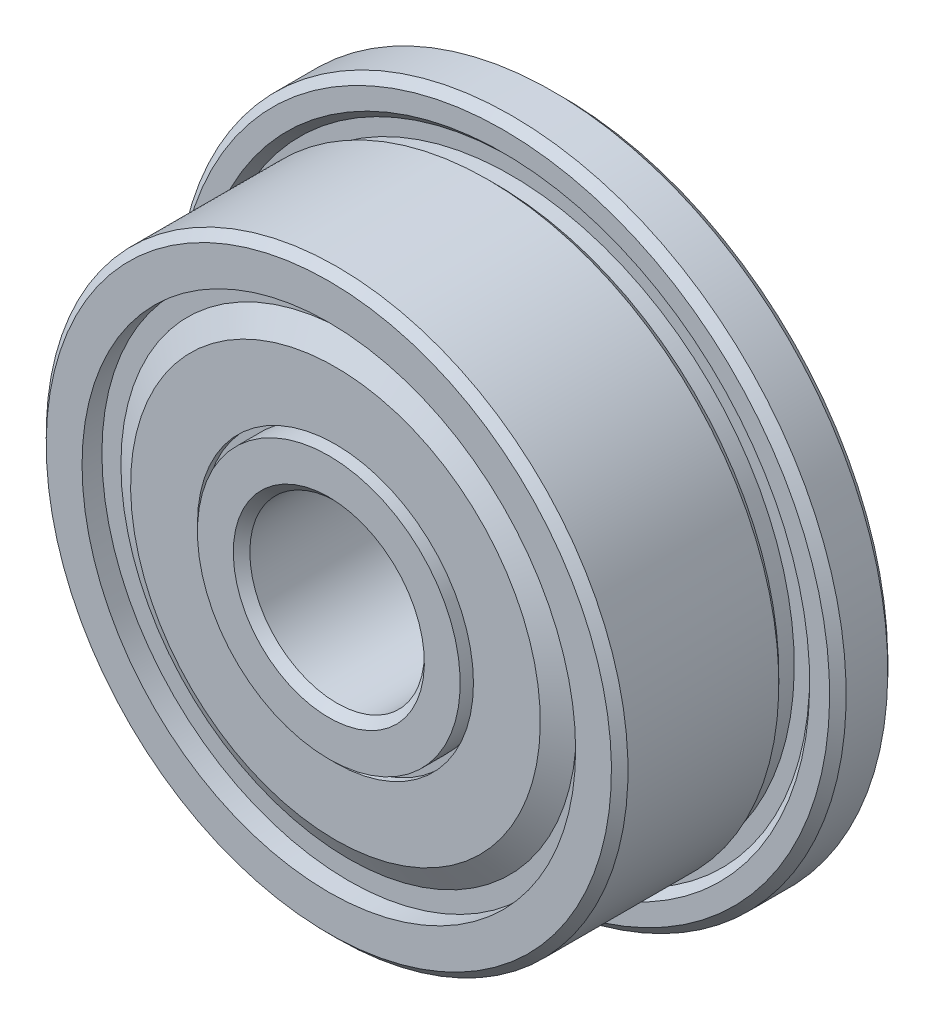
ISO-10303-21;
HEADER;
FILE_DESCRIPTION(('STEP AP214'),'2;1');
FILE_NAME('part.step','',(''),(''),'','','');
FILE_SCHEMA(('AUTOMOTIVE_DESIGN { 1 0 10303 214 1 1 1 1 }'));
ENDSEC;
DATA;
#1=APPLICATION_CONTEXT('core data for automotive mechanical design processes');
#2=APPLICATION_PROTOCOL_DEFINITION('international standard','automotive_design',2000,#1);
#3=PRODUCT_CONTEXT('',#1,'mechanical');
#4=PRODUCT('Part','Part','',(#3));
#5=PRODUCT_RELATED_PRODUCT_CATEGORY('part','',(#4));
#6=PRODUCT_DEFINITION_FORMATION('','',#4);
#7=PRODUCT_DEFINITION_CONTEXT('part definition',#1,'design');
#8=PRODUCT_DEFINITION('design','',#6,#7);
#9=PRODUCT_DEFINITION_SHAPE('','',#8);
#10=(LENGTH_UNIT() NAMED_UNIT(*) SI_UNIT(.MILLI.,.METRE.));
#11=(NAMED_UNIT(*) PLANE_ANGLE_UNIT() SI_UNIT($,.RADIAN.));
#12=(NAMED_UNIT(*) SI_UNIT($,.STERADIAN.) SOLID_ANGLE_UNIT());
#13=UNCERTAINTY_MEASURE_WITH_UNIT(LENGTH_MEASURE(1.E-05),#10,'distance_accuracy_value','');
#14=(GEOMETRIC_REPRESENTATION_CONTEXT(3) GLOBAL_UNCERTAINTY_ASSIGNED_CONTEXT((#13)) GLOBAL_UNIT_ASSIGNED_CONTEXT((#10,
#11,#12)) REPRESENTATION_CONTEXT('',''));
#15=CARTESIAN_POINT('',(0.,0.,0.));
#16=DIRECTION('',(0.,0.,1.));
#17=DIRECTION('',(1.,0.,0.));
#18=AXIS2_PLACEMENT_3D('',#15,#16,#17);
#19=CARTESIAN_POINT('',(0.,0.,0.));
#20=DIRECTION('',(0.,0.,1.));
#21=DIRECTION('',(0.,-1.,0.));
#22=AXIS2_PLACEMENT_3D('',#19,#20,#21);
#23=CYLINDRICAL_SURFACE('',#22,4.24166666666667);
#24=CARTESIAN_POINT('',(0.,0.,-1.545));
#25=DIRECTION('',(0.,0.,1.));
#26=DIRECTION('',(0.,-1.,0.));
#27=AXIS2_PLACEMENT_3D('',#24,#25,#26);
#28=CIRCLE('',#27,4.24166666666667);
#29=CARTESIAN_POINT('',(0.,-4.24166666666667,-1.545));
#30=VERTEX_POINT('',#29);
#31=EDGE_CURVE('E77',#30,#30,#28,.T.);
#32=ORIENTED_EDGE('',*,*,#31,.F.);
#33=EDGE_LOOP('',(#32));
#34=FACE_BOUND('',#33,.T.);
#35=CARTESIAN_POINT('',(0.,0.,-1.65875));
#36=DIRECTION('',(0.,0.,1.));
#37=DIRECTION('',(0.,-1.,0.));
#38=AXIS2_PLACEMENT_3D('',#35,#36,#37);
#39=CIRCLE('',#38,4.24166666666667);
#40=CARTESIAN_POINT('',(0.,-4.24166666666667,-1.65875));
#41=VERTEX_POINT('',#40);
#42=EDGE_CURVE('E12',#41,#41,#39,.T.);
#43=ORIENTED_EDGE('',*,*,#42,.T.);
#44=EDGE_LOOP('',(#43));
#45=FACE_BOUND('',#44,.T.);
#46=ADVANCED_FACE('F49',(#34,#45),#23,.T.);
#47=CARTESIAN_POINT('',(0.,4.24166666666667,-1.65875));
#48=DIRECTION('',(0.,0.,1.));
#49=DIRECTION('',(0.,-1.,0.));
#50=AXIS2_PLACEMENT_3D('',#47,#48,#49);
#51=PLANE('',#50);
#52=ORIENTED_EDGE('',*,*,#42,.F.);
#53=EDGE_LOOP('',(#52));
#54=FACE_BOUND('',#53,.T.);
#55=CARTESIAN_POINT('',(0.,0.,-1.65875));
#56=DIRECTION('',(0.,0.,1.));
#57=DIRECTION('',(0.,-1.,0.));
#58=AXIS2_PLACEMENT_3D('',#55,#56,#57);
#59=CIRCLE('',#58,3.91500303016285);
#60=CARTESIAN_POINT('',(0.,-3.91500303016285,-1.65875));
#61=VERTEX_POINT('',#60);
#62=EDGE_CURVE('E55',#61,#61,#59,.T.);
#63=ORIENTED_EDGE('',*,*,#62,.T.);
#64=EDGE_LOOP('',(#63));
#65=FACE_BOUND('',#64,.T.);
#66=ADVANCED_FACE('F84',(#54,#65),#51,.F.);
#67=CARTESIAN_POINT('',(0.,0.,-1.88625));
#68=DIRECTION('',(0.,0.,1.));
#69=DIRECTION('',(0.,-1.,0.));
#70=AXIS2_PLACEMENT_3D('',#67,#68,#69);
#71=CONICAL_SURFACE('',#70,3.52096147144093,1.0471975511966);
#72=ORIENTED_EDGE('',*,*,#62,.F.);
#73=EDGE_LOOP('',(#72));
#74=FACE_BOUND('',#73,.T.);
#75=CARTESIAN_POINT('',(0.,0.,-1.88625));
#76=DIRECTION('',(0.,0.,1.));
#77=DIRECTION('',(0.,-1.,0.));
#78=AXIS2_PLACEMENT_3D('',#75,#76,#77);
#79=CIRCLE('',#78,3.52096147144093);
#80=CARTESIAN_POINT('',(0.,-3.52096147144093,-1.88625));
#81=VERTEX_POINT('',#80);
#82=EDGE_CURVE('E59',#81,#81,#79,.T.);
#83=ORIENTED_EDGE('',*,*,#82,.T.);
#84=EDGE_LOOP('',(#83));
#85=FACE_BOUND('',#84,.T.);
#86=ADVANCED_FACE('F88',(#74,#85),#71,.T.);
#87=CARTESIAN_POINT('',(0.,3.52096147144093,-1.88625));
#88=DIRECTION('',(0.,0.,1.));
#89=DIRECTION('',(0.,-1.,0.));
#90=AXIS2_PLACEMENT_3D('',#87,#88,#89);
#91=PLANE('',#90);
#92=ORIENTED_EDGE('',*,*,#82,.F.);
#93=EDGE_LOOP('',(#92));
#94=FACE_BOUND('',#93,.T.);
#95=CARTESIAN_POINT('',(0.,0.,-1.88625));
#96=DIRECTION('',(0.,0.,1.));
#97=DIRECTION('',(0.,-1.,0.));
#98=AXIS2_PLACEMENT_3D('',#95,#96,#97);
#99=CIRCLE('',#98,2.37208333333333);
#100=CARTESIAN_POINT('',(0.,-2.37208333333333,-1.88625));
#101=VERTEX_POINT('',#100);
#102=EDGE_CURVE('E63',#101,#101,#99,.T.);
#103=ORIENTED_EDGE('',*,*,#102,.T.);
#104=EDGE_LOOP('',(#103));
#105=FACE_BOUND('',#104,.T.);
#106=ADVANCED_FACE('F93',(#94,#105),#91,.F.);
#107=CARTESIAN_POINT('',(0.,0.,0.));
#108=DIRECTION('',(0.,0.,1.));
#109=DIRECTION('',(0.,-1.,0.));
#110=AXIS2_PLACEMENT_3D('',#107,#108,#109);
#111=CYLINDRICAL_SURFACE('',#110,2.37208333333333);
#112=ORIENTED_EDGE('',*,*,#102,.F.);
#113=EDGE_LOOP('',(#112));
#114=FACE_BOUND('',#113,.T.);
#115=CARTESIAN_POINT('',(0.,0.,-1.7725));
#116=DIRECTION('',(0.,0.,1.));
#117=DIRECTION('',(0.,-1.,0.));
#118=AXIS2_PLACEMENT_3D('',#115,#116,#117);
#119=CIRCLE('',#118,2.37208333333333);
#120=CARTESIAN_POINT('',(0.,-2.37208333333333,-1.7725));
#121=VERTEX_POINT('',#120);
#122=EDGE_CURVE('E68',#121,#121,#119,.T.);
#123=ORIENTED_EDGE('',*,*,#122,.T.);
#124=EDGE_LOOP('',(#123));
#125=FACE_BOUND('',#124,.T.);
#126=ADVANCED_FACE('F99',(#114,#125),#111,.F.);
#127=CARTESIAN_POINT('',(0.,3.49048225080189,-1.7725));
#128=DIRECTION('',(0.,0.,-1.));
#129=DIRECTION('',(0.,1.,0.));
#130=AXIS2_PLACEMENT_3D('',#127,#128,#129);
#131=PLANE('',#130);
#132=ORIENTED_EDGE('',*,*,#122,.F.);
#133=EDGE_LOOP('',(#132));
#134=FACE_BOUND('',#133,.T.);
#135=CARTESIAN_POINT('',(0.,0.,-1.7725));
#136=DIRECTION('',(0.,0.,1.));
#137=DIRECTION('',(0.,-1.,0.));
#138=AXIS2_PLACEMENT_3D('',#135,#136,#137);
#139=CIRCLE('',#138,3.49048225080189);
#140=CARTESIAN_POINT('',(0.,-3.49048225080189,-1.7725));
#141=VERTEX_POINT('',#140);
#142=EDGE_CURVE('E71',#141,#141,#139,.T.);
#143=ORIENTED_EDGE('',*,*,#142,.T.);
#144=EDGE_LOOP('',(#143));
#145=FACE_BOUND('',#144,.T.);
#146=ADVANCED_FACE('F103',(#134,#145),#131,.F.);
#147=CARTESIAN_POINT('',(0.,0.,-1.545));
#148=DIRECTION('',(0.,0.,1.));
#149=DIRECTION('',(0.,-1.,0.));
#150=AXIS2_PLACEMENT_3D('',#147,#148,#149);
#151=CONICAL_SURFACE('',#150,3.88452380952381,1.0471975511966);
#152=ORIENTED_EDGE('',*,*,#142,.F.);
#153=EDGE_LOOP('',(#152));
#154=FACE_BOUND('',#153,.T.);
#155=CARTESIAN_POINT('',(0.,0.,-1.545));
#156=DIRECTION('',(0.,0.,1.));
#157=DIRECTION('',(0.,-1.,0.));
#158=AXIS2_PLACEMENT_3D('',#155,#156,#157);
#159=CIRCLE('',#158,3.88452380952381);
#160=CARTESIAN_POINT('',(0.,-3.88452380952381,-1.545));
#161=VERTEX_POINT('',#160);
#162=EDGE_CURVE('E74',#161,#161,#159,.T.);
#163=ORIENTED_EDGE('',*,*,#162,.T.);
#164=EDGE_LOOP('',(#163));
#165=FACE_BOUND('',#164,.T.);
#166=ADVANCED_FACE('F107',(#154,#165),#151,.F.);
#167=CARTESIAN_POINT('',(0.,4.24166666666667,-1.545));
#168=DIRECTION('',(0.,0.,-1.));
#169=DIRECTION('',(0.,1.,0.));
#170=AXIS2_PLACEMENT_3D('',#167,#168,#169);
#171=PLANE('',#170);
#172=ORIENTED_EDGE('',*,*,#162,.F.);
#173=EDGE_LOOP('',(#172));
#174=FACE_BOUND('',#173,.T.);
#175=ORIENTED_EDGE('',*,*,#31,.T.);
#176=EDGE_LOOP('',(#175));
#177=FACE_BOUND('',#176,.T.);
#178=ADVANCED_FACE('F81',(#174,#177),#171,.F.);
#179=CLOSED_SHELL('',(#46,#66,#86,#106,#126,#146,#166,#178));
#180=MANIFOLD_SOLID_BREP('B2',#179);
#181=CARTESIAN_POINT('',(0.,0.,0.));
#182=DIRECTION('',(0.,0.,1.));
#183=DIRECTION('',(0.,-1.,0.));
#184=AXIS2_PLACEMENT_3D('',#181,#182,#183);
#185=CYLINDRICAL_SURFACE('',#184,4.24166666666667);
#186=CARTESIAN_POINT('',(0.,0.,1.65875));
#187=DIRECTION('',(0.,0.,1.));
#188=DIRECTION('',(0.,-1.,0.));
#189=AXIS2_PLACEMENT_3D('',#186,#187,#188);
#190=CIRCLE('',#189,4.24166666666667);
#191=CARTESIAN_POINT('',(0.,-4.24166666666667,1.65875));
#192=VERTEX_POINT('',#191);
#193=EDGE_CURVE('E48',#192,#192,#190,.T.);
#194=ORIENTED_EDGE('',*,*,#193,.F.);
#195=EDGE_LOOP('',(#194));
#196=FACE_BOUND('',#195,.T.);
#197=CARTESIAN_POINT('',(0.,0.,1.545));
#198=DIRECTION('',(0.,0.,1.));
#199=DIRECTION('',(0.,-1.,0.));
#200=AXIS2_PLACEMENT_3D('',#197,#198,#199);
#201=CIRCLE('',#200,4.24166666666667);
#202=CARTESIAN_POINT('',(0.,-4.24166666666667,1.545));
#203=VERTEX_POINT('',#202);
#204=EDGE_CURVE('E204',#203,#203,#201,.T.);
#205=ORIENTED_EDGE('',*,*,#204,.T.);
#206=EDGE_LOOP('',(#205));
#207=FACE_BOUND('',#206,.T.);
#208=ADVANCED_FACE('F176',(#196,#207),#185,.T.);
#209=CARTESIAN_POINT('',(0.,4.24166666666667,1.65875));
#210=DIRECTION('',(0.,0.,-1.));
#211=DIRECTION('',(0.,1.,0.));
#212=AXIS2_PLACEMENT_3D('',#209,#210,#211);
#213=PLANE('',#212);
#214=CARTESIAN_POINT('',(0.,0.,1.65875));
#215=DIRECTION('',(0.,0.,1.));
#216=DIRECTION('',(0.,-1.,0.));
#217=AXIS2_PLACEMENT_3D('',#214,#215,#216);
#218=CIRCLE('',#217,3.91500303016285);
#219=CARTESIAN_POINT('',(0.,-3.91500303016285,1.65875));
#220=VERTEX_POINT('',#219);
#221=EDGE_CURVE('E182',#220,#220,#218,.T.);
#222=ORIENTED_EDGE('',*,*,#221,.F.);
#223=EDGE_LOOP('',(#222));
#224=FACE_BOUND('',#223,.T.);
#225=ORIENTED_EDGE('',*,*,#193,.T.);
#226=EDGE_LOOP('',(#225));
#227=FACE_BOUND('',#226,.T.);
#228=ADVANCED_FACE('F241',(#224,#227),#213,.F.);
#229=CARTESIAN_POINT('',(0.,0.,1.65875));
#230=DIRECTION('',(0.,0.,-1.));
#231=DIRECTION('',(0.,1.,0.));
#232=AXIS2_PLACEMENT_3D('',#229,#230,#231);
#233=CONICAL_SURFACE('',#232,3.91500303016285,1.0471975511966);
#234=CARTESIAN_POINT('',(0.,0.,1.88625));
#235=DIRECTION('',(0.,0.,1.));
#236=DIRECTION('',(0.,-1.,0.));
#237=AXIS2_PLACEMENT_3D('',#234,#235,#236);
#238=CIRCLE('',#237,3.52096147144093);
#239=CARTESIAN_POINT('',(0.,-3.52096147144093,1.88625));
#240=VERTEX_POINT('',#239);
#241=EDGE_CURVE('E186',#240,#240,#238,.T.);
#242=ORIENTED_EDGE('',*,*,#241,.F.);
#243=EDGE_LOOP('',(#242));
#244=FACE_BOUND('',#243,.T.);
#245=ORIENTED_EDGE('',*,*,#221,.T.);
#246=EDGE_LOOP('',(#245));
#247=FACE_BOUND('',#246,.T.);
#248=ADVANCED_FACE('F236',(#244,#247),#233,.T.);
#249=CARTESIAN_POINT('',(0.,3.52096147144093,1.88625));
#250=DIRECTION('',(0.,0.,-1.));
#251=DIRECTION('',(0.,1.,0.));
#252=AXIS2_PLACEMENT_3D('',#249,#250,#251);
#253=PLANE('',#252);
#254=CARTESIAN_POINT('',(0.,0.,1.88625));
#255=DIRECTION('',(0.,0.,1.));
#256=DIRECTION('',(0.,-1.,0.));
#257=AXIS2_PLACEMENT_3D('',#254,#255,#256);
#258=CIRCLE('',#257,2.37208333333333);
#259=CARTESIAN_POINT('',(0.,-2.37208333333333,1.88625));
#260=VERTEX_POINT('',#259);
#261=EDGE_CURVE('E190',#260,#260,#258,.T.);
#262=ORIENTED_EDGE('',*,*,#261,.F.);
#263=EDGE_LOOP('',(#262));
#264=FACE_BOUND('',#263,.T.);
#265=ORIENTED_EDGE('',*,*,#241,.T.);
#266=EDGE_LOOP('',(#265));
#267=FACE_BOUND('',#266,.T.);
#268=ADVANCED_FACE('F230',(#264,#267),#253,.F.);
#269=CARTESIAN_POINT('',(0.,0.,0.));
#270=DIRECTION('',(0.,0.,1.));
#271=DIRECTION('',(0.,-1.,0.));
#272=AXIS2_PLACEMENT_3D('',#269,#270,#271);
#273=CYLINDRICAL_SURFACE('',#272,2.37208333333333);
#274=CARTESIAN_POINT('',(0.,0.,1.7725));
#275=DIRECTION('',(0.,0.,1.));
#276=DIRECTION('',(0.,-1.,0.));
#277=AXIS2_PLACEMENT_3D('',#274,#275,#276);
#278=CIRCLE('',#277,2.37208333333333);
#279=CARTESIAN_POINT('',(0.,-2.37208333333333,1.7725));
#280=VERTEX_POINT('',#279);
#281=EDGE_CURVE('E195',#280,#280,#278,.T.);
#282=ORIENTED_EDGE('',*,*,#281,.F.);
#283=EDGE_LOOP('',(#282));
#284=FACE_BOUND('',#283,.T.);
#285=ORIENTED_EDGE('',*,*,#261,.T.);
#286=EDGE_LOOP('',(#285));
#287=FACE_BOUND('',#286,.T.);
#288=ADVANCED_FACE('F224',(#284,#287),#273,.F.);
#289=CARTESIAN_POINT('',(0.,3.49048225080189,1.7725));
#290=DIRECTION('',(0.,0.,1.));
#291=DIRECTION('',(0.,-1.,0.));
#292=AXIS2_PLACEMENT_3D('',#289,#290,#291);
#293=PLANE('',#292);
#294=CARTESIAN_POINT('',(0.,0.,1.7725));
#295=DIRECTION('',(0.,0.,1.));
#296=DIRECTION('',(0.,-1.,0.));
#297=AXIS2_PLACEMENT_3D('',#294,#295,#296);
#298=CIRCLE('',#297,3.49048225080189);
#299=CARTESIAN_POINT('',(0.,-3.49048225080189,1.7725));
#300=VERTEX_POINT('',#299);
#301=EDGE_CURVE('E198',#300,#300,#298,.T.);
#302=ORIENTED_EDGE('',*,*,#301,.F.);
#303=EDGE_LOOP('',(#302));
#304=FACE_BOUND('',#303,.T.);
#305=ORIENTED_EDGE('',*,*,#281,.T.);
#306=EDGE_LOOP('',(#305));
#307=FACE_BOUND('',#306,.T.);
#308=ADVANCED_FACE('F218',(#304,#307),#293,.F.);
#309=CARTESIAN_POINT('',(0.,0.,1.7725));
#310=DIRECTION('',(0.,0.,-1.));
#311=DIRECTION('',(0.,1.,0.));
#312=AXIS2_PLACEMENT_3D('',#309,#310,#311);
#313=CONICAL_SURFACE('',#312,3.49048225080189,1.0471975511966);
#314=CARTESIAN_POINT('',(0.,0.,1.545));
#315=DIRECTION('',(0.,0.,1.));
#316=DIRECTION('',(0.,-1.,0.));
#317=AXIS2_PLACEMENT_3D('',#314,#315,#316);
#318=CIRCLE('',#317,3.88452380952381);
#319=CARTESIAN_POINT('',(0.,-3.88452380952381,1.545));
#320=VERTEX_POINT('',#319);
#321=EDGE_CURVE('E201',#320,#320,#318,.T.);
#322=ORIENTED_EDGE('',*,*,#321,.F.);
#323=EDGE_LOOP('',(#322));
#324=FACE_BOUND('',#323,.T.);
#325=ORIENTED_EDGE('',*,*,#301,.T.);
#326=EDGE_LOOP('',(#325));
#327=FACE_BOUND('',#326,.T.);
#328=ADVANCED_FACE('F212',(#324,#327),#313,.F.);
#329=CARTESIAN_POINT('',(0.,4.24166666666667,1.545));
#330=DIRECTION('',(0.,0.,1.));
#331=DIRECTION('',(0.,-1.,0.));
#332=AXIS2_PLACEMENT_3D('',#329,#330,#331);
#333=PLANE('',#332);
#334=ORIENTED_EDGE('',*,*,#204,.F.);
#335=EDGE_LOOP('',(#334));
#336=FACE_BOUND('',#335,.T.);
#337=ORIENTED_EDGE('',*,*,#321,.T.);
#338=EDGE_LOOP('',(#337));
#339=FACE_BOUND('',#338,.T.);
#340=ADVANCED_FACE('F209',(#336,#339),#333,.F.);
#341=CLOSED_SHELL('',(#208,#228,#248,#268,#288,#308,#328,#340));
#342=MANIFOLD_SOLID_BREP('B7',#341);
#343=CARTESIAN_POINT('',(-2.08905973148122,2.48964444013671,0.));
#344=DIRECTION('',(-0.64278760968653,0.766044443118986,0.));
#345=DIRECTION('',(0.766044443118986,0.64278760968653,0.));
#346=AXIS2_PLACEMENT_3D('',#343,#344,#345);
#347=SPHERICAL_SURFACE('',#346,0.794);
#348=CARTESIAN_POINT('',(-2.59943309357233,3.09788372797318,0.));
#349=VERTEX_POINT('',#348);
#350=VERTEX_LOOP('',#349);
#351=FACE_BOUND('',#350,.T.);
#352=ADVANCED_FACE('F303',(#351),#347,.T.);
#353=CLOSED_SHELL('',(#352));
#354=MANIFOLD_SOLID_BREP('B43',#353);
#355=CARTESIAN_POINT('',(-3.20062519728967,0.564356577417557,0.));
#356=DIRECTION('',(-0.984807753012206,0.17364817766694,0.));
#357=DIRECTION('',(0.17364817766694,0.984807753012206,0.));
#358=AXIS2_PLACEMENT_3D('',#355,#356,#357);
#359=SPHERICAL_SURFACE('',#358,0.794);
#360=CARTESIAN_POINT('',(-3.98256255318136,0.702233230485107,0.));
#361=VERTEX_POINT('',#360);
#362=VERTEX_LOOP('',#361);
#363=FACE_BOUND('',#362,.T.);
#364=ADVANCED_FACE('F321',(#363),#359,.T.);
#365=CLOSED_SHELL('',(#364));
#366=MANIFOLD_SOLID_BREP('B172',#365);
#367=CARTESIAN_POINT('',(-2.81458256229944,-1.62499999999997,0.));
#368=DIRECTION('',(-0.866025403784443,-0.499999999999992,0.));
#369=DIRECTION('',(-0.499999999999992,0.866025403784443,0.));
#370=AXIS2_PLACEMENT_3D('',#367,#368,#369);
#371=SPHERICAL_SURFACE('',#370,0.794);
#372=CARTESIAN_POINT('',(-3.50220673290429,-2.02199999999997,0.));
#373=VERTEX_POINT('',#372);
#374=VERTEX_LOOP('',#373);
#375=FACE_BOUND('',#374,.T.);
#376=ADVANCED_FACE('F339',(#375),#371,.T.);
#377=CLOSED_SHELL('',(#376));
#378=MANIFOLD_SOLID_BREP('B299',#377);
#379=CARTESIAN_POINT('',(-1.11156546580845,-3.05400101755419,0.));
#380=DIRECTION('',(-0.342020143325676,-0.939692620785906,0.));
#381=DIRECTION('',(-0.939692620785906,0.342020143325676,0.));
#382=AXIS2_PLACEMENT_3D('',#379,#380,#381);
#383=SPHERICAL_SURFACE('',#382,0.794);
#384=CARTESIAN_POINT('',(-1.38312945960903,-3.8001169584582,0.));
#385=VERTEX_POINT('',#384);
#386=VERTEX_LOOP('',#385);
#387=FACE_BOUND('',#386,.T.);
#388=ADVANCED_FACE('F357',(#387),#383,.T.);
#389=CLOSED_SHELL('',(#388));
#390=MANIFOLD_SOLID_BREP('B317',#389);
#391=CARTESIAN_POINT('',(1.11156546580841,-3.05400101755421,0.));
#392=DIRECTION('',(0.342020143325663,-0.939692620785911,0.));
#393=DIRECTION('',(-0.939692620785911,-0.342020143325663,0.));
#394=AXIS2_PLACEMENT_3D('',#391,#392,#393);
#395=SPHERICAL_SURFACE('',#394,0.794);
#396=CARTESIAN_POINT('',(1.38312945960898,-3.80011695845822,0.));
#397=VERTEX_POINT('',#396);
#398=VERTEX_LOOP('',#397);
#399=FACE_BOUND('',#398,.T.);
#400=ADVANCED_FACE('F375',(#399),#395,.T.);
#401=CLOSED_SHELL('',(#400));
#402=MANIFOLD_SOLID_BREP('B335',#401);
#403=CARTESIAN_POINT('',(2.81458256229942,-1.62500000000001,0.));
#404=DIRECTION('',(0.866025403784437,-0.500000000000004,0.));
#405=DIRECTION('',(-0.500000000000004,-0.866025403784437,0.));
#406=AXIS2_PLACEMENT_3D('',#403,#404,#405);
#407=SPHERICAL_SURFACE('',#406,0.794);
#408=CARTESIAN_POINT('',(3.50220673290426,-2.02200000000002,0.));
#409=VERTEX_POINT('',#408);
#410=VERTEX_LOOP('',#409);
#411=FACE_BOUND('',#410,.T.);
#412=ADVANCED_FACE('F393',(#411),#407,.T.);
#413=CLOSED_SHELL('',(#412));
#414=MANIFOLD_SOLID_BREP('B353',#413);
#415=CARTESIAN_POINT('',(3.20062519728968,0.564356577417514,0.));
#416=DIRECTION('',(0.984807753012209,0.173648177666928,0.));
#417=DIRECTION('',(0.173648177666928,-0.984807753012209,0.));
#418=AXIS2_PLACEMENT_3D('',#415,#416,#417);
#419=SPHERICAL_SURFACE('',#418,0.794);
#420=CARTESIAN_POINT('',(3.98256255318137,0.702233230485054,0.));
#421=VERTEX_POINT('',#420);
#422=VERTEX_LOOP('',#421);
#423=FACE_BOUND('',#422,.T.);
#424=ADVANCED_FACE('F411',(#423),#419,.T.);
#425=CLOSED_SHELL('',(#424));
#426=MANIFOLD_SOLID_BREP('B371',#425);
#427=CARTESIAN_POINT('',(2.08905973148126,2.48964444013668,0.));
#428=DIRECTION('',(0.64278760968654,0.766044443118977,0.));
#429=DIRECTION('',(0.766044443118977,-0.64278760968654,0.));
#430=AXIS2_PLACEMENT_3D('',#427,#428,#429);
#431=SPHERICAL_SURFACE('',#430,0.794);
#432=CARTESIAN_POINT('',(2.59943309357237,3.09788372797314,0.));
#433=VERTEX_POINT('',#432);
#434=VERTEX_LOOP('',#433);
#435=FACE_BOUND('',#434,.T.);
#436=ADVANCED_FACE('F429',(#435),#431,.T.);
#437=CLOSED_SHELL('',(#436));
#438=MANIFOLD_SOLID_BREP('B389',#437);
#439=CARTESIAN_POINT('',(0.,3.25,0.));
#440=DIRECTION('',(0.,1.,0.));
#441=DIRECTION('',(1.,0.,0.));
#442=AXIS2_PLACEMENT_3D('',#439,#440,#441);
#443=SPHERICAL_SURFACE('',#442,0.794);
#444=CARTESIAN_POINT('',(0.,4.044,0.));
#445=VERTEX_POINT('',#444);
#446=VERTEX_LOOP('',#445);
#447=FACE_BOUND('',#446,.T.);
#448=ADVANCED_FACE('F450',(#447),#443,.T.);
#449=CLOSED_SHELL('',(#448));
#450=MANIFOLD_SOLID_BREP('B407',#449);
#451=CARTESIAN_POINT('',(0.,0.,0.));
#452=DIRECTION('',(0.,0.,1.));
#453=DIRECTION('',(0.,-1.,0.));
#454=AXIS2_PLACEMENT_3D('',#451,#452,#453);
#455=CYLINDRICAL_SURFACE('',#454,2.6375);
#456=CARTESIAN_POINT('',(0.,0.,0.505252164765279));
#457=DIRECTION('',(0.,0.,1.));
#458=DIRECTION('',(0.,-1.,0.));
#459=AXIS2_PLACEMENT_3D('',#456,#457,#458);
#460=CIRCLE('',#459,2.6375);
#461=CARTESIAN_POINT('',(0.,-2.6375,0.505252164765279));
#462=VERTEX_POINT('',#461);
#463=EDGE_CURVE('E495',#462,#462,#460,.T.);
#464=ORIENTED_EDGE('',*,*,#463,.T.);
#465=EDGE_LOOP('',(#464));
#466=FACE_BOUND('',#465,.T.);
#467=CARTESIAN_POINT('',(0.,0.,1.545));
#468=DIRECTION('',(0.,0.,1.));
#469=DIRECTION('',(0.,-1.,0.));
#470=AXIS2_PLACEMENT_3D('',#467,#468,#469);
#471=CIRCLE('',#470,2.6375);
#472=CARTESIAN_POINT('',(0.,-2.6375,1.545));
#473=VERTEX_POINT('',#472);
#474=EDGE_CURVE('E513',#473,#473,#471,.T.);
#475=ORIENTED_EDGE('',*,*,#474,.F.);
#476=EDGE_LOOP('',(#475));
#477=FACE_BOUND('',#476,.T.);
#478=ADVANCED_FACE('F472',(#466,#477),#455,.T.);
#479=CARTESIAN_POINT('',(0.,1.5,2.));
#480=DIRECTION('',(0.,0.,-1.));
#481=DIRECTION('',(0.,1.,0.));
#482=AXIS2_PLACEMENT_3D('',#479,#480,#481);
#483=PLANE('',#482);
#484=CARTESIAN_POINT('',(0.,0.,2.));
#485=DIRECTION('',(0.,0.,-1.));
#486=DIRECTION('',(0.,1.,0.));
#487=AXIS2_PLACEMENT_3D('',#484,#485,#486);
#488=CIRCLE('',#487,1.6421875);
#489=CARTESIAN_POINT('',(0.,1.6421875,2.));
#490=VERTEX_POINT('',#489);
#491=EDGE_CURVE('E449',#490,#490,#488,.T.);
#492=ORIENTED_EDGE('',*,*,#491,.T.);
#493=EDGE_LOOP('',(#492));
#494=FACE_BOUND('',#493,.T.);
#495=CARTESIAN_POINT('',(0.,0.,2.));
#496=DIRECTION('',(0.,0.,1.));
#497=DIRECTION('',(0.,-1.,0.));
#498=AXIS2_PLACEMENT_3D('',#495,#496,#497);
#499=CIRCLE('',#498,2.25833333333333);
#500=CARTESIAN_POINT('',(0.,-2.25833333333333,2.));
#501=VERTEX_POINT('',#500);
#502=EDGE_CURVE('E507',#501,#501,#499,.T.);
#503=ORIENTED_EDGE('',*,*,#502,.T.);
#504=EDGE_LOOP('',(#503));
#505=FACE_BOUND('',#504,.T.);
#506=ADVANCED_FACE('F521',(#494,#505),#483,.F.);
#507=CARTESIAN_POINT('',(0.,0.,0.));
#508=DIRECTION('',(0.,0.,1.));
#509=DIRECTION('',(0.,-1.,0.));
#510=AXIS2_PLACEMENT_3D('',#507,#508,#509);
#511=CYLINDRICAL_SURFACE('',#510,2.6375);
#512=CARTESIAN_POINT('',(0.,0.,-0.505252164765279));
#513=DIRECTION('',(0.,0.,1.));
#514=DIRECTION('',(0.,-1.,0.));
#515=AXIS2_PLACEMENT_3D('',#512,#513,#514);
#516=CIRCLE('',#515,2.6375);
#517=CARTESIAN_POINT('',(0.,-2.6375,-0.505252164765278));
#518=VERTEX_POINT('',#517);
#519=EDGE_CURVE('E492',#518,#518,#516,.T.);
#520=ORIENTED_EDGE('',*,*,#519,.F.);
#521=EDGE_LOOP('',(#520));
#522=FACE_BOUND('',#521,.T.);
#523=CARTESIAN_POINT('',(0.,0.,-1.545));
#524=DIRECTION('',(0.,0.,1.));
#525=DIRECTION('',(0.,-1.,0.));
#526=AXIS2_PLACEMENT_3D('',#523,#524,#525);
#527=CIRCLE('',#526,2.6375);
#528=CARTESIAN_POINT('',(0.,-2.6375,-1.545));
#529=VERTEX_POINT('',#528);
#530=EDGE_CURVE('E504',#529,#529,#527,.T.);
#531=ORIENTED_EDGE('',*,*,#530,.T.);
#532=EDGE_LOOP('',(#531));
#533=FACE_BOUND('',#532,.T.);
#534=ADVANCED_FACE('F527',(#522,#533),#511,.T.);
#535=CARTESIAN_POINT('',(0.,2.6375,-2.));
#536=DIRECTION('',(0.,0.,1.));
#537=DIRECTION('',(0.,-1.,0.));
#538=AXIS2_PLACEMENT_3D('',#535,#536,#537);
#539=PLANE('',#538);
#540=CARTESIAN_POINT('',(0.,0.,-2.));
#541=DIRECTION('',(0.,0.,1.));
#542=DIRECTION('',(0.,-1.,0.));
#543=AXIS2_PLACEMENT_3D('',#540,#541,#542);
#544=CIRCLE('',#543,1.6421875);
#545=CARTESIAN_POINT('',(0.,-1.6421875,-2.));
#546=VERTEX_POINT('',#545);
#547=EDGE_CURVE('E487',#546,#546,#544,.T.);
#548=ORIENTED_EDGE('',*,*,#547,.T.);
#549=EDGE_LOOP('',(#548));
#550=FACE_BOUND('',#549,.T.);
#551=CARTESIAN_POINT('',(0.,0.,-2.));
#552=DIRECTION('',(0.,0.,1.));
#553=DIRECTION('',(0.,-1.,0.));
#554=AXIS2_PLACEMENT_3D('',#551,#552,#553);
#555=CIRCLE('',#554,2.25833333333333);
#556=CARTESIAN_POINT('',(0.,-2.25833333333333,-2.));
#557=VERTEX_POINT('',#556);
#558=EDGE_CURVE('E498',#557,#557,#555,.T.);
#559=ORIENTED_EDGE('',*,*,#558,.F.);
#560=EDGE_LOOP('',(#559));
#561=FACE_BOUND('',#560,.T.);
#562=ADVANCED_FACE('F535',(#550,#561),#539,.F.);
#563=CARTESIAN_POINT('',(0.,0.,0.));
#564=DIRECTION('',(0.,0.,1.));
#565=DIRECTION('',(0.,-1.,0.));
#566=AXIS2_PLACEMENT_3D('',#563,#564,#565);
#567=TOROIDAL_SURFACE('',#566,3.25,0.794);
#568=ORIENTED_EDGE('',*,*,#463,.F.);
#569=EDGE_LOOP('',(#568));
#570=FACE_BOUND('',#569,.T.);
#571=ORIENTED_EDGE('',*,*,#519,.T.);
#572=EDGE_LOOP('',(#571));
#573=FACE_BOUND('',#572,.T.);
#574=ADVANCED_FACE('F531',(#570,#573),#567,.F.);
#575=CARTESIAN_POINT('',(0.,0.,0.));
#576=DIRECTION('',(0.,0.,1.));
#577=DIRECTION('',(0.,-1.,0.));
#578=AXIS2_PLACEMENT_3D('',#575,#576,#577);
#579=CYLINDRICAL_SURFACE('',#578,1.5);
#580=CARTESIAN_POINT('',(0.,0.,-1.8578125));
#581=DIRECTION('',(0.,0.,1.));
#582=DIRECTION('',(0.,-1.,0.));
#583=AXIS2_PLACEMENT_3D('',#580,#581,#582);
#584=CIRCLE('',#583,1.5);
#585=CARTESIAN_POINT('',(0.,-1.5,-1.8578125));
#586=VERTEX_POINT('',#585);
#587=EDGE_CURVE('E479',#586,#586,#584,.F.);
#588=ORIENTED_EDGE('',*,*,#587,.T.);
#589=EDGE_LOOP('',(#588));
#590=FACE_BOUND('',#589,.T.);
#591=CARTESIAN_POINT('',(0.,0.,1.8578125));
#592=DIRECTION('',(0.,0.,-1.));
#593=DIRECTION('',(0.,1.,0.));
#594=AXIS2_PLACEMENT_3D('',#591,#592,#593);
#595=CIRCLE('',#594,1.5);
#596=CARTESIAN_POINT('',(0.,1.5,1.8578125));
#597=VERTEX_POINT('',#596);
#598=EDGE_CURVE('E483',#597,#597,#595,.F.);
#599=ORIENTED_EDGE('',*,*,#598,.T.);
#600=EDGE_LOOP('',(#599));
#601=FACE_BOUND('',#600,.T.);
#602=ADVANCED_FACE('F534',(#590,#601),#579,.F.);
#603=CARTESIAN_POINT('',(0.,0.,-2.));
#604=DIRECTION('',(0.,0.,-1.));
#605=DIRECTION('',(0.,1.,0.));
#606=AXIS2_PLACEMENT_3D('',#603,#604,#605);
#607=CONICAL_SURFACE('',#606,1.6421875,0.785398163397448);
#608=ORIENTED_EDGE('',*,*,#587,.F.);
#609=EDGE_LOOP('',(#608));
#610=FACE_BOUND('',#609,.T.);
#611=ORIENTED_EDGE('',*,*,#547,.F.);
#612=EDGE_LOOP('',(#611));
#613=FACE_BOUND('',#612,.T.);
#614=ADVANCED_FACE('F539',(#610,#613),#607,.F.);
#615=CARTESIAN_POINT('',(0.,0.,1.8578125));
#616=DIRECTION('',(0.,0.,1.));
#617=DIRECTION('',(0.,-1.,0.));
#618=AXIS2_PLACEMENT_3D('',#615,#616,#617);
#619=CONICAL_SURFACE('',#618,1.5,0.785398163397448);
#620=ORIENTED_EDGE('',*,*,#491,.F.);
#621=EDGE_LOOP('',(#620));
#622=FACE_BOUND('',#621,.T.);
#623=ORIENTED_EDGE('',*,*,#598,.F.);
#624=EDGE_LOOP('',(#623));
#625=FACE_BOUND('',#624,.T.);
#626=ADVANCED_FACE('F474',(#622,#625),#619,.F.);
#627=CARTESIAN_POINT('',(0.,0.,0.));
#628=DIRECTION('',(0.,0.,1.));
#629=DIRECTION('',(0.,-1.,0.));
#630=AXIS2_PLACEMENT_3D('',#627,#628,#629);
#631=CYLINDRICAL_SURFACE('',#630,2.25833333333333);
#632=ORIENTED_EDGE('',*,*,#558,.T.);
#633=EDGE_LOOP('',(#632));
#634=FACE_BOUND('',#633,.T.);
#635=CARTESIAN_POINT('',(0.,0.,-1.545));
#636=DIRECTION('',(0.,0.,1.));
#637=DIRECTION('',(0.,-1.,0.));
#638=AXIS2_PLACEMENT_3D('',#635,#636,#637);
#639=CIRCLE('',#638,2.25833333333333);
#640=CARTESIAN_POINT('',(0.,-2.25833333333333,-1.545));
#641=VERTEX_POINT('',#640);
#642=EDGE_CURVE('E501',#641,#641,#639,.T.);
#643=ORIENTED_EDGE('',*,*,#642,.F.);
#644=EDGE_LOOP('',(#643));
#645=FACE_BOUND('',#644,.T.);
#646=ADVANCED_FACE('F546',(#634,#645),#631,.T.);
#647=CARTESIAN_POINT('',(0.,2.6375,-1.545));
#648=DIRECTION('',(0.,0.,-1.));
#649=DIRECTION('',(0.,1.,0.));
#650=AXIS2_PLACEMENT_3D('',#647,#648,#649);
#651=PLANE('',#650);
#652=ORIENTED_EDGE('',*,*,#642,.T.);
#653=EDGE_LOOP('',(#652));
#654=FACE_BOUND('',#653,.T.);
#655=ORIENTED_EDGE('',*,*,#530,.F.);
#656=EDGE_LOOP('',(#655));
#657=FACE_BOUND('',#656,.T.);
#658=ADVANCED_FACE('F558',(#654,#657),#651,.T.);
#659=CARTESIAN_POINT('',(0.,0.,0.));
#660=DIRECTION('',(0.,0.,1.));
#661=DIRECTION('',(0.,-1.,0.));
#662=AXIS2_PLACEMENT_3D('',#659,#660,#661);
#663=CYLINDRICAL_SURFACE('',#662,2.25833333333333);
#664=CARTESIAN_POINT('',(0.,0.,1.545));
#665=DIRECTION('',(0.,0.,1.));
#666=DIRECTION('',(0.,-1.,0.));
#667=AXIS2_PLACEMENT_3D('',#664,#665,#666);
#668=CIRCLE('',#667,2.25833333333333);
#669=CARTESIAN_POINT('',(0.,-2.25833333333333,1.545));
#670=VERTEX_POINT('',#669);
#671=EDGE_CURVE('E510',#670,#670,#668,.T.);
#672=ORIENTED_EDGE('',*,*,#671,.T.);
#673=EDGE_LOOP('',(#672));
#674=FACE_BOUND('',#673,.T.);
#675=ORIENTED_EDGE('',*,*,#502,.F.);
#676=EDGE_LOOP('',(#675));
#677=FACE_BOUND('',#676,.T.);
#678=ADVANCED_FACE('F564',(#674,#677),#663,.T.);
#679=CARTESIAN_POINT('',(0.,2.6375,1.545));
#680=DIRECTION('',(0.,0.,1.));
#681=DIRECTION('',(0.,-1.,0.));
#682=AXIS2_PLACEMENT_3D('',#679,#680,#681);
#683=PLANE('',#682);
#684=ORIENTED_EDGE('',*,*,#474,.T.);
#685=EDGE_LOOP('',(#684));
#686=FACE_BOUND('',#685,.T.);
#687=ORIENTED_EDGE('',*,*,#671,.F.);
#688=EDGE_LOOP('',(#687));
#689=FACE_BOUND('',#688,.T.);
#690=ADVANCED_FACE('F517',(#686,#689),#683,.T.);
#691=CLOSED_SHELL('',(#478,#506,#534,#562,#574,#602,#614,#626,#646,#658,#678,#690));
#692=MANIFOLD_SOLID_BREP('B425',#691);
#693=CARTESIAN_POINT('',(0.,3.8625,-2.));
#694=DIRECTION('',(0.,0.,1.));
#695=DIRECTION('',(0.,-1.,0.));
#696=AXIS2_PLACEMENT_3D('',#693,#694,#695);
#697=PLANE('',#696);
#698=CARTESIAN_POINT('',(0.,0.,-2.));
#699=DIRECTION('',(0.,0.,1.));
#700=DIRECTION('',(0.,-1.,0.));
#701=AXIS2_PLACEMENT_3D('',#698,#699,#700);
#702=CIRCLE('',#701,5.6078125);
#703=CARTESIAN_POINT('',(0.,-5.6078125,-2.));
#704=VERTEX_POINT('',#703);
#705=EDGE_CURVE('E674',#704,#704,#702,.F.);
#706=ORIENTED_EDGE('',*,*,#705,.T.);
#707=EDGE_LOOP('',(#706));
#708=FACE_BOUND('',#707,.T.);
#709=CARTESIAN_POINT('',(0.,0.,-2.));
#710=DIRECTION('',(0.,0.,1.));
#711=DIRECTION('',(0.,-1.,0.));
#712=AXIS2_PLACEMENT_3D('',#709,#710,#711);
#713=CIRCLE('',#712,4.24166666666667);
#714=CARTESIAN_POINT('',(0.,-4.24166666666667,-2.));
#715=VERTEX_POINT('',#714);
#716=EDGE_CURVE('E715',#715,#715,#713,.T.);
#717=ORIENTED_EDGE('',*,*,#716,.T.);
#718=EDGE_LOOP('',(#717));
#719=FACE_BOUND('',#718,.T.);
#720=ADVANCED_FACE('F659',(#708,#719),#697,.F.);
#721=CARTESIAN_POINT('',(0.,0.,0.));
#722=DIRECTION('',(0.,0.,1.));
#723=DIRECTION('',(0.,-1.,0.));
#724=AXIS2_PLACEMENT_3D('',#721,#722,#723);
#725=CYLINDRICAL_SURFACE('',#724,3.8625);
#726=CARTESIAN_POINT('',(0.,0.,-0.505252164765279));
#727=DIRECTION('',(0.,0.,1.));
#728=DIRECTION('',(0.,-1.,0.));
#729=AXIS2_PLACEMENT_3D('',#726,#727,#728);
#730=CIRCLE('',#729,3.8625);
#731=CARTESIAN_POINT('',(0.,-3.8625,-0.505252164765279));
#732=VERTEX_POINT('',#731);
#733=EDGE_CURVE('E685',#732,#732,#730,.T.);
#734=ORIENTED_EDGE('',*,*,#733,.T.);
#735=EDGE_LOOP('',(#734));
#736=FACE_BOUND('',#735,.T.);
#737=CARTESIAN_POINT('',(0.,0.,-1.545));
#738=DIRECTION('',(0.,0.,1.));
#739=DIRECTION('',(0.,-1.,0.));
#740=AXIS2_PLACEMENT_3D('',#737,#738,#739);
#741=CIRCLE('',#740,3.8625);
#742=CARTESIAN_POINT('',(0.,-3.8625,-1.545));
#743=VERTEX_POINT('',#742);
#744=EDGE_CURVE('E721',#743,#743,#741,.T.);
#745=ORIENTED_EDGE('',*,*,#744,.F.);
#746=EDGE_LOOP('',(#745));
#747=FACE_BOUND('',#746,.T.);
#748=ADVANCED_FACE('F728',(#736,#747),#725,.F.);
#749=CARTESIAN_POINT('',(0.,0.,0.));
#750=DIRECTION('',(0.,0.,1.));
#751=DIRECTION('',(0.,-1.,0.));
#752=AXIS2_PLACEMENT_3D('',#749,#750,#751);
#753=CYLINDRICAL_SURFACE('',#752,3.8625);
#754=CARTESIAN_POINT('',(0.,0.,0.505252164765279));
#755=DIRECTION('',(0.,0.,1.));
#756=DIRECTION('',(0.,-1.,0.));
#757=AXIS2_PLACEMENT_3D('',#754,#755,#756);
#758=CIRCLE('',#757,3.8625);
#759=CARTESIAN_POINT('',(0.,-3.8625,0.505252164765279));
#760=VERTEX_POINT('',#759);
#761=EDGE_CURVE('E688',#760,#760,#758,.T.);
#762=ORIENTED_EDGE('',*,*,#761,.F.);
#763=EDGE_LOOP('',(#762));
#764=FACE_BOUND('',#763,.T.);
#765=CARTESIAN_POINT('',(0.,0.,1.545));
#766=DIRECTION('',(0.,0.,1.));
#767=DIRECTION('',(0.,-1.,0.));
#768=AXIS2_PLACEMENT_3D('',#765,#766,#767);
#769=CIRCLE('',#768,3.8625);
#770=CARTESIAN_POINT('',(0.,-3.8625,1.545));
#771=VERTEX_POINT('',#770);
#772=EDGE_CURVE('E712',#771,#771,#769,.T.);
#773=ORIENTED_EDGE('',*,*,#772,.T.);
#774=EDGE_LOOP('',(#773));
#775=FACE_BOUND('',#774,.T.);
#776=ADVANCED_FACE('F730',(#764,#775),#753,.F.);
#777=CARTESIAN_POINT('',(0.,5.,2.));
#778=DIRECTION('',(0.,0.,-1.));
#779=DIRECTION('',(0.,1.,0.));
#780=AXIS2_PLACEMENT_3D('',#777,#778,#779);
#781=PLANE('',#780);
#782=CARTESIAN_POINT('',(0.,0.,2.));
#783=DIRECTION('',(0.,0.,-1.));
#784=DIRECTION('',(0.,1.,0.));
#785=AXIS2_PLACEMENT_3D('',#782,#783,#784);
#786=CIRCLE('',#785,4.8578125);
#787=CARTESIAN_POINT('',(0.,4.8578125,2.));
#788=VERTEX_POINT('',#787);
#789=EDGE_CURVE('E666',#788,#788,#786,.F.);
#790=ORIENTED_EDGE('',*,*,#789,.T.);
#791=EDGE_LOOP('',(#790));
#792=FACE_BOUND('',#791,.T.);
#793=CARTESIAN_POINT('',(0.,0.,2.));
#794=DIRECTION('',(0.,0.,1.));
#795=DIRECTION('',(0.,-1.,0.));
#796=AXIS2_PLACEMENT_3D('',#793,#794,#795);
#797=CIRCLE('',#796,4.24166666666667);
#798=CARTESIAN_POINT('',(0.,-4.24166666666667,2.));
#799=VERTEX_POINT('',#798);
#800=EDGE_CURVE('E706',#799,#799,#797,.T.);
#801=ORIENTED_EDGE('',*,*,#800,.F.);
#802=EDGE_LOOP('',(#801));
#803=FACE_BOUND('',#802,.T.);
#804=ADVANCED_FACE('F737',(#792,#803),#781,.F.);
#805=CARTESIAN_POINT('',(0.,0.,0.));
#806=DIRECTION('',(0.,0.,1.));
#807=DIRECTION('',(0.,-1.,0.));
#808=AXIS2_PLACEMENT_3D('',#805,#806,#807);
#809=TOROIDAL_SURFACE('',#808,3.25,0.794);
#810=ORIENTED_EDGE('',*,*,#733,.F.);
#811=EDGE_LOOP('',(#810));
#812=FACE_BOUND('',#811,.T.);
#813=ORIENTED_EDGE('',*,*,#761,.T.);
#814=EDGE_LOOP('',(#813));
#815=FACE_BOUND('',#814,.T.);
#816=ADVANCED_FACE('F743',(#812,#815),#809,.F.);
#817=CARTESIAN_POINT('',(0.,0.,0.));
#818=DIRECTION('',(0.,0.,1.));
#819=DIRECTION('',(0.,-1.,0.));
#820=AXIS2_PLACEMENT_3D('',#817,#818,#819);
#821=CYLINDRICAL_SURFACE('',#820,5.);
#822=CARTESIAN_POINT('',(0.,0.,1.8578125));
#823=DIRECTION('',(0.,0.,-1.));
#824=DIRECTION('',(0.,1.,0.));
#825=AXIS2_PLACEMENT_3D('',#822,#823,#824);
#826=CIRCLE('',#825,5.);
#827=CARTESIAN_POINT('',(0.,5.,1.8578125));
#828=VERTEX_POINT('',#827);
#829=EDGE_CURVE('E471',#828,#828,#826,.T.);
#830=ORIENTED_EDGE('',*,*,#829,.T.);
#831=EDGE_LOOP('',(#830));
#832=FACE_BOUND('',#831,.T.);
#833=CARTESIAN_POINT('',(0.,0.,-0.734834957055044));
#834=DIRECTION('',(0.,0.,1.));
#835=DIRECTION('',(0.,-1.,0.));
#836=AXIS2_PLACEMENT_3D('',#833,#834,#835);
#837=CIRCLE('',#836,5.);
#838=CARTESIAN_POINT('',(0.,-5.,-0.734834957055044));
#839=VERTEX_POINT('',#838);
#840=EDGE_CURVE('E691',#839,#839,#837,.T.);
#841=ORIENTED_EDGE('',*,*,#840,.T.);
#842=EDGE_LOOP('',(#841));
#843=FACE_BOUND('',#842,.T.);
#844=ADVANCED_FACE('F787',(#832,#843),#821,.T.);
#845=CARTESIAN_POINT('',(0.,0.,-0.867417478527523));
#846=DIRECTION('',(0.,0.,1.));
#847=DIRECTION('',(0.,-1.,0.));
#848=AXIS2_PLACEMENT_3D('',#845,#846,#847);
#849=CONICAL_SURFACE('',#848,4.86741747852752,0.785398163397446);
#850=ORIENTED_EDGE('',*,*,#840,.F.);
#851=EDGE_LOOP('',(#850));
#852=FACE_BOUND('',#851,.T.);
#853=CARTESIAN_POINT('',(0.,0.,-0.867417478527523));
#854=DIRECTION('',(0.,0.,1.));
#855=DIRECTION('',(0.,-1.,0.));
#856=AXIS2_PLACEMENT_3D('',#853,#854,#855);
#857=CIRCLE('',#856,4.86741747852752);
#858=CARTESIAN_POINT('',(0.,-4.86741747852752,-0.867417478527523));
#859=VERTEX_POINT('',#858);
#860=EDGE_CURVE('E694',#859,#859,#857,.T.);
#861=ORIENTED_EDGE('',*,*,#860,.T.);
#862=EDGE_LOOP('',(#861));
#863=FACE_BOUND('',#862,.T.);
#864=ADVANCED_FACE('F783',(#852,#863),#849,.T.);
#865=CARTESIAN_POINT('',(0.,0.,0.));
#866=DIRECTION('',(0.,0.,1.));
#867=DIRECTION('',(0.,-1.,0.));
#868=AXIS2_PLACEMENT_3D('',#865,#866,#867);
#869=CYLINDRICAL_SURFACE('',#868,4.86741747852752);
#870=ORIENTED_EDGE('',*,*,#860,.F.);
#871=EDGE_LOOP('',(#870));
#872=FACE_BOUND('',#871,.T.);
#873=CARTESIAN_POINT('',(0.,0.,-1.13258252147248));
#874=DIRECTION('',(0.,0.,1.));
#875=DIRECTION('',(0.,-1.,0.));
#876=AXIS2_PLACEMENT_3D('',#873,#874,#875);
#877=CIRCLE('',#876,4.86741747852752);
#878=CARTESIAN_POINT('',(0.,-4.86741747852752,-1.13258252147248));
#879=VERTEX_POINT('',#878);
#880=EDGE_CURVE('E697',#879,#879,#877,.T.);
#881=ORIENTED_EDGE('',*,*,#880,.T.);
#882=EDGE_LOOP('',(#881));
#883=FACE_BOUND('',#882,.T.);
#884=ADVANCED_FACE('F775',(#872,#883),#869,.T.);
#885=CARTESIAN_POINT('',(0.,5.13258252147248,-1.13258252147248));
#886=DIRECTION('',(0.,0.,-1.));
#887=DIRECTION('',(0.,1.,0.));
#888=AXIS2_PLACEMENT_3D('',#885,#886,#887);
#889=PLANE('',#888);
#890=ORIENTED_EDGE('',*,*,#880,.F.);
#891=EDGE_LOOP('',(#890));
#892=FACE_BOUND('',#891,.T.);
#893=CARTESIAN_POINT('',(0.,0.,-1.13258252147248));
#894=DIRECTION('',(0.,0.,1.));
#895=DIRECTION('',(0.,-1.,0.));
#896=AXIS2_PLACEMENT_3D('',#893,#894,#895);
#897=CIRCLE('',#896,5.13258252147248);
#898=CARTESIAN_POINT('',(0.,-5.13258252147248,-1.13258252147248));
#899=VERTEX_POINT('',#898);
#900=EDGE_CURVE('E700',#899,#899,#897,.T.);
#901=ORIENTED_EDGE('',*,*,#900,.T.);
#902=EDGE_LOOP('',(#901));
#903=FACE_BOUND('',#902,.T.);
#904=ADVANCED_FACE('F769',(#892,#903),#889,.F.);
#905=CARTESIAN_POINT('',(0.,0.,-1.));
#906=DIRECTION('',(0.,0.,1.));
#907=DIRECTION('',(0.,-1.,0.));
#908=AXIS2_PLACEMENT_3D('',#905,#906,#907);
#909=CONICAL_SURFACE('',#908,5.26516504294495,0.785398163397445);
#910=ORIENTED_EDGE('',*,*,#900,.F.);
#911=EDGE_LOOP('',(#910));
#912=FACE_BOUND('',#911,.T.);
#913=CARTESIAN_POINT('',(0.,0.,-1.));
#914=DIRECTION('',(0.,0.,1.));
#915=DIRECTION('',(0.,-1.,0.));
#916=AXIS2_PLACEMENT_3D('',#913,#914,#915);
#917=CIRCLE('',#916,5.26516504294495);
#918=CARTESIAN_POINT('',(0.,-5.26516504294495,-1.));
#919=VERTEX_POINT('',#918);
#920=EDGE_CURVE('E703',#919,#919,#917,.T.);
#921=ORIENTED_EDGE('',*,*,#920,.T.);
#922=EDGE_LOOP('',(#921));
#923=FACE_BOUND('',#922,.T.);
#924=ADVANCED_FACE('F764',(#912,#923),#909,.F.);
#925=CARTESIAN_POINT('',(0.,5.75,-1.));
#926=DIRECTION('',(0.,0.,-1.));
#927=DIRECTION('',(0.,1.,0.));
#928=AXIS2_PLACEMENT_3D('',#925,#926,#927);
#929=PLANE('',#928);
#930=CARTESIAN_POINT('',(0.,0.,-1.));
#931=DIRECTION('',(0.,0.,-1.));
#932=DIRECTION('',(0.,1.,0.));
#933=AXIS2_PLACEMENT_3D('',#930,#931,#932);
#934=CIRCLE('',#933,5.6078125);
#935=CARTESIAN_POINT('',(0.,5.6078125,-1.));
#936=VERTEX_POINT('',#935);
#937=EDGE_CURVE('E670',#936,#936,#934,.F.);
#938=ORIENTED_EDGE('',*,*,#937,.T.);
#939=EDGE_LOOP('',(#938));
#940=FACE_BOUND('',#939,.T.);
#941=ORIENTED_EDGE('',*,*,#920,.F.);
#942=EDGE_LOOP('',(#941));
#943=FACE_BOUND('',#942,.T.);
#944=ADVANCED_FACE('F761',(#940,#943),#929,.F.);
#945=CARTESIAN_POINT('',(0.,0.,0.));
#946=DIRECTION('',(0.,0.,1.));
#947=DIRECTION('',(0.,-1.,0.));
#948=AXIS2_PLACEMENT_3D('',#945,#946,#947);
#949=CYLINDRICAL_SURFACE('',#948,5.75);
#950=CARTESIAN_POINT('',(0.,0.,-1.8578125));
#951=DIRECTION('',(0.,0.,1.));
#952=DIRECTION('',(0.,-1.,0.));
#953=AXIS2_PLACEMENT_3D('',#950,#951,#952);
#954=CIRCLE('',#953,5.75);
#955=CARTESIAN_POINT('',(0.,-5.75,-1.8578125));
#956=VERTEX_POINT('',#955);
#957=EDGE_CURVE('E679',#956,#956,#954,.T.);
#958=ORIENTED_EDGE('',*,*,#957,.T.);
#959=EDGE_LOOP('',(#958));
#960=FACE_BOUND('',#959,.T.);
#961=CARTESIAN_POINT('',(0.,0.,-1.1421875));
#962=DIRECTION('',(0.,0.,-1.));
#963=DIRECTION('',(0.,1.,0.));
#964=AXIS2_PLACEMENT_3D('',#961,#962,#963);
#965=CIRCLE('',#964,5.75);
#966=CARTESIAN_POINT('',(0.,5.75,-1.1421875));
#967=VERTEX_POINT('',#966);
#968=EDGE_CURVE('E682',#967,#967,#965,.T.);
#969=ORIENTED_EDGE('',*,*,#968,.T.);
#970=EDGE_LOOP('',(#969));
#971=FACE_BOUND('',#970,.T.);
#972=ADVANCED_FACE('F748',(#960,#971),#949,.T.);
#973=CARTESIAN_POINT('',(0.,0.,-1.8578125));
#974=DIRECTION('',(0.,0.,1.));
#975=DIRECTION('',(0.,-1.,0.));
#976=AXIS2_PLACEMENT_3D('',#973,#974,#975);
#977=CONICAL_SURFACE('',#976,5.75,0.785398163397448);
#978=ORIENTED_EDGE('',*,*,#705,.F.);
#979=EDGE_LOOP('',(#978));
#980=FACE_BOUND('',#979,.T.);
#981=ORIENTED_EDGE('',*,*,#957,.F.);
#982=EDGE_LOOP('',(#981));
#983=FACE_BOUND('',#982,.T.);
#984=ADVANCED_FACE('F745',(#980,#983),#977,.T.);
#985=CARTESIAN_POINT('',(0.,0.,-1.));
#986=DIRECTION('',(0.,0.,-1.));
#987=DIRECTION('',(0.,1.,0.));
#988=AXIS2_PLACEMENT_3D('',#985,#986,#987);
#989=CONICAL_SURFACE('',#988,5.6078125,0.785398163397448);
#990=ORIENTED_EDGE('',*,*,#968,.F.);
#991=EDGE_LOOP('',(#990));
#992=FACE_BOUND('',#991,.T.);
#993=ORIENTED_EDGE('',*,*,#937,.F.);
#994=EDGE_LOOP('',(#993));
#995=FACE_BOUND('',#994,.T.);
#996=ADVANCED_FACE('F747',(#992,#995),#989,.T.);
#997=CARTESIAN_POINT('',(0.,0.,2.));
#998=DIRECTION('',(0.,0.,-1.));
#999=DIRECTION('',(0.,1.,0.));
#1000=AXIS2_PLACEMENT_3D('',#997,#998,#999);
#1001=CONICAL_SURFACE('',#1000,4.8578125,0.785398163397449);
#1002=ORIENTED_EDGE('',*,*,#829,.F.);
#1003=EDGE_LOOP('',(#1002));
#1004=FACE_BOUND('',#1003,.T.);
#1005=ORIENTED_EDGE('',*,*,#789,.F.);
#1006=EDGE_LOOP('',(#1005));
#1007=FACE_BOUND('',#1006,.T.);
#1008=ADVANCED_FACE('F661',(#1004,#1007),#1001,.T.);
#1009=CARTESIAN_POINT('',(0.,0.,0.));
#1010=DIRECTION('',(0.,0.,1.));
#1011=DIRECTION('',(0.,-1.,0.));
#1012=AXIS2_PLACEMENT_3D('',#1009,#1010,#1011);
#1013=CYLINDRICAL_SURFACE('',#1012,4.24166666666667);
#1014=ORIENTED_EDGE('',*,*,#800,.T.);
#1015=EDGE_LOOP('',(#1014));
#1016=FACE_BOUND('',#1015,.T.);
#1017=CARTESIAN_POINT('',(0.,0.,1.545));
#1018=DIRECTION('',(0.,0.,1.));
#1019=DIRECTION('',(0.,-1.,0.));
#1020=AXIS2_PLACEMENT_3D('',#1017,#1018,#1019);
#1021=CIRCLE('',#1020,4.24166666666667);
#1022=CARTESIAN_POINT('',(0.,-4.24166666666667,1.545));
#1023=VERTEX_POINT('',#1022);
#1024=EDGE_CURVE('E709',#1023,#1023,#1021,.T.);
#1025=ORIENTED_EDGE('',*,*,#1024,.F.);
#1026=EDGE_LOOP('',(#1025));
#1027=FACE_BOUND('',#1026,.T.);
#1028=ADVANCED_FACE('F755',(#1016,#1027),#1013,.F.);
#1029=CARTESIAN_POINT('',(0.,3.8625,1.545));
#1030=DIRECTION('',(0.,0.,1.));
#1031=DIRECTION('',(0.,-1.,0.));
#1032=AXIS2_PLACEMENT_3D('',#1029,#1030,#1031);
#1033=PLANE('',#1032);
#1034=ORIENTED_EDGE('',*,*,#1024,.T.);
#1035=EDGE_LOOP('',(#1034));
#1036=FACE_BOUND('',#1035,.T.);
#1037=ORIENTED_EDGE('',*,*,#772,.F.);
#1038=EDGE_LOOP('',(#1037));
#1039=FACE_BOUND('',#1038,.T.);
#1040=ADVANCED_FACE('F801',(#1036,#1039),#1033,.T.);
#1041=CARTESIAN_POINT('',(0.,0.,0.));
#1042=DIRECTION('',(0.,0.,1.));
#1043=DIRECTION('',(0.,-1.,0.));
#1044=AXIS2_PLACEMENT_3D('',#1041,#1042,#1043);
#1045=CYLINDRICAL_SURFACE('',#1044,4.24166666666667);
#1046=CARTESIAN_POINT('',(0.,0.,-1.545));
#1047=DIRECTION('',(0.,0.,1.));
#1048=DIRECTION('',(0.,-1.,0.));
#1049=AXIS2_PLACEMENT_3D('',#1046,#1047,#1048);
#1050=CIRCLE('',#1049,4.24166666666667);
#1051=CARTESIAN_POINT('',(0.,-4.24166666666667,-1.545));
#1052=VERTEX_POINT('',#1051);
#1053=EDGE_CURVE('E718',#1052,#1052,#1050,.T.);
#1054=ORIENTED_EDGE('',*,*,#1053,.T.);
#1055=EDGE_LOOP('',(#1054));
#1056=FACE_BOUND('',#1055,.T.);
#1057=ORIENTED_EDGE('',*,*,#716,.F.);
#1058=EDGE_LOOP('',(#1057));
#1059=FACE_BOUND('',#1058,.T.);
#1060=ADVANCED_FACE('F807',(#1056,#1059),#1045,.F.);
#1061=CARTESIAN_POINT('',(0.,3.8625,-1.545));
#1062=DIRECTION('',(0.,0.,-1.));
#1063=DIRECTION('',(0.,1.,0.));
#1064=AXIS2_PLACEMENT_3D('',#1061,#1062,#1063);
#1065=PLANE('',#1064);
#1066=ORIENTED_EDGE('',*,*,#744,.T.);
#1067=EDGE_LOOP('',(#1066));
#1068=FACE_BOUND('',#1067,.T.);
#1069=ORIENTED_EDGE('',*,*,#1053,.F.);
#1070=EDGE_LOOP('',(#1069));
#1071=FACE_BOUND('',#1070,.T.);
#1072=ADVANCED_FACE('F725',(#1068,#1071),#1065,.T.);
#1073=CLOSED_SHELL('',(#720,#748,#776,#804,#816,#844,#864,#884,#904,#924,#944,#972,#984,#996,
#1008,#1028,#1040,#1060,#1072));
#1074=MANIFOLD_SOLID_BREP('B444',#1073);
#1075=ADVANCED_BREP_SHAPE_REPRESENTATION('',(#18,#180,#342,#354,#366,#378,#390,#402,#414,#426,
#438,#450,#692,#1074),#14);
#1076=SHAPE_DEFINITION_REPRESENTATION(#9,#1075);
ENDSEC;
END-ISO-10303-21;
